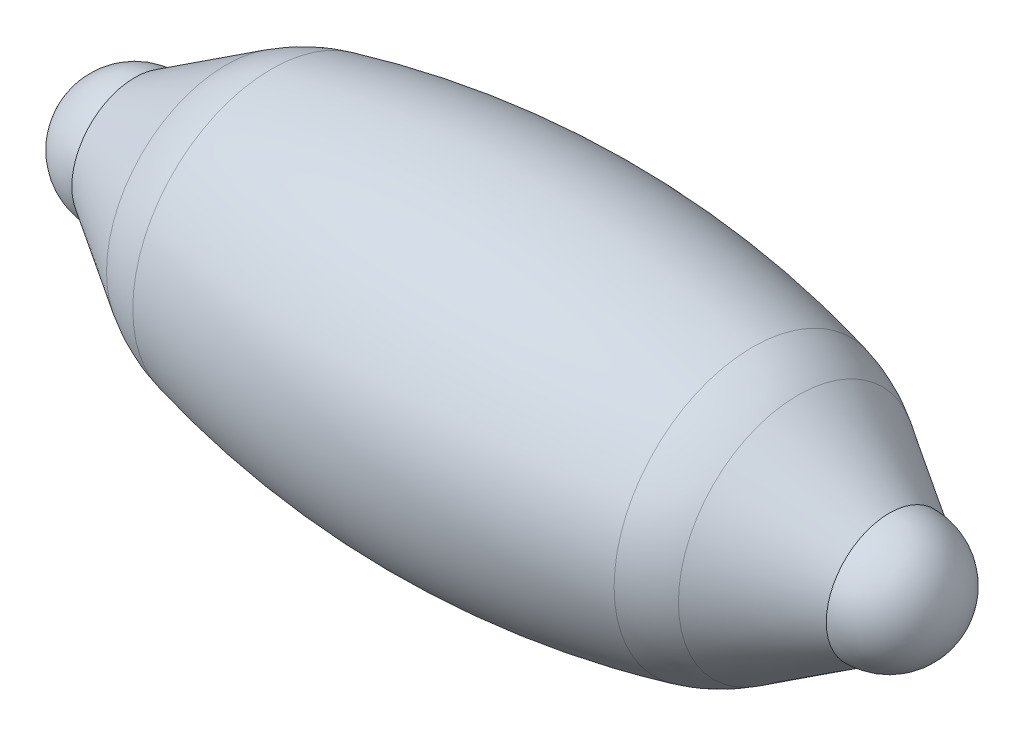
ISO-10303-21;
HEADER;
FILE_DESCRIPTION(('STEP AP214'),'2;1');
FILE_NAME('part.step','',(''),(''),'','','');
FILE_SCHEMA(('AUTOMOTIVE_DESIGN { 1 0 10303 214 1 1 1 1 }'));
ENDSEC;
DATA;
#1=APPLICATION_CONTEXT('core data for automotive mechanical design processes');
#2=APPLICATION_PROTOCOL_DEFINITION('international standard','automotive_design',2000,#1);
#3=PRODUCT_CONTEXT('',#1,'mechanical');
#4=PRODUCT('Part','Part','',(#3));
#5=PRODUCT_RELATED_PRODUCT_CATEGORY('part','',(#4));
#6=PRODUCT_DEFINITION_FORMATION('','',#4);
#7=PRODUCT_DEFINITION_CONTEXT('part definition',#1,'design');
#8=PRODUCT_DEFINITION('design','',#6,#7);
#9=PRODUCT_DEFINITION_SHAPE('','',#8);
#10=(LENGTH_UNIT() NAMED_UNIT(*) SI_UNIT(.MILLI.,.METRE.));
#11=(NAMED_UNIT(*) PLANE_ANGLE_UNIT() SI_UNIT($,.RADIAN.));
#12=(NAMED_UNIT(*) SI_UNIT($,.STERADIAN.) SOLID_ANGLE_UNIT());
#13=UNCERTAINTY_MEASURE_WITH_UNIT(LENGTH_MEASURE(1.E-05),#10,'distance_accuracy_value','');
#14=(GEOMETRIC_REPRESENTATION_CONTEXT(3) GLOBAL_UNCERTAINTY_ASSIGNED_CONTEXT((#13)) GLOBAL_UNIT_ASSIGNED_CONTEXT((#10,
#11,#12)) REPRESENTATION_CONTEXT('',''));
#15=CARTESIAN_POINT('',(0.,0.,0.));
#16=DIRECTION('',(0.,0.,1.));
#17=DIRECTION('',(1.,0.,0.));
#18=AXIS2_PLACEMENT_3D('',#15,#16,#17);
#19=CARTESIAN_POINT('',(0.,26.6698833461372,0.));
#20=DIRECTION('',(-1.,0.,0.));
#21=DIRECTION('',(0.,-1.,0.));
#22=AXIS2_PLACEMENT_3D('',#19,#20,#21);
#23=DEGENERATE_TOROIDAL_SURFACE('',#22,26.6698833461372,32.,.F.);
#24=CARTESIAN_POINT('',(7.64764973067392,26.6698833461372,0.));
#25=DIRECTION('',(-1.,0.,0.));
#26=DIRECTION('',(0.,-1.,0.));
#27=AXIS2_PLACEMENT_3D('',#24,#25,#26);
#28=CIRCLE('',#27,4.40282901691414);
#29=CARTESIAN_POINT('',(7.64764973067392,22.267054329223,0.));
#30=VERTEX_POINT('',#29);
#31=EDGE_CURVE('E50',#30,#30,#28,.T.);
#32=ORIENTED_EDGE('',*,*,#31,.T.);
#33=EDGE_LOOP('',(#32));
#34=FACE_BOUND('',#33,.T.);
#35=CARTESIAN_POINT('',(-7.64764973067384,26.6698833461372,0.));
#36=DIRECTION('',(1.,0.,0.));
#37=DIRECTION('',(0.,1.,0.));
#38=AXIS2_PLACEMENT_3D('',#35,#36,#37);
#39=CIRCLE('',#38,4.40282901691417);
#40=CARTESIAN_POINT('',(-7.64764973067385,31.0727123630513,0.));
#41=VERTEX_POINT('',#40);
#42=EDGE_CURVE('E54',#41,#41,#39,.T.);
#43=ORIENTED_EDGE('',*,*,#42,.T.);
#44=EDGE_LOOP('',(#43));
#45=FACE_BOUND('',#44,.T.);
#46=ADVANCED_FACE('F39',(#34,#45),#23,.F.);
#47=CARTESIAN_POINT('',(-11.9874109893092,26.6698833461372,0.));
#48=DIRECTION('',(1.,0.,0.));
#49=DIRECTION('',(0.,1.,0.));
#50=AXIS2_PLACEMENT_3D('',#47,#48,#49);
#51=CONICAL_SURFACE('',#50,1.99999999999998,0.554802966926318);
#52=CARTESIAN_POINT('',(-9.0865836176551,26.6698833461372,0.));
#53=DIRECTION('',(1.,0.,0.));
#54=DIRECTION('',(0.,1.,0.));
#55=AXIS2_PLACEMENT_3D('',#52,#53,#54);
#56=CIRCLE('',#55,3.79773895533652);
#57=CARTESIAN_POINT('',(-9.0865836176551,30.4676223014737,0.));
#58=VERTEX_POINT('',#57);
#59=EDGE_CURVE('E10',#58,#58,#56,.F.);
#60=CARTESIAN_POINT('',(-11.9874109893092,26.6698833461372,0.));
#61=DIRECTION('',(1.,0.,0.));
#62=DIRECTION('',(0.,1.,0.));
#63=AXIS2_PLACEMENT_3D('',#60,#61,#62);
#64=CIRCLE('',#63,1.99999999999998);
#65=CARTESIAN_POINT('',(-11.9874109893092,28.6698833461372,0.));
#66=VERTEX_POINT('',#65);
#67=EDGE_CURVE('E62',#66,#66,#64,.F.);
#68=CARTESIAN_POINT('',(-9.0865836176551,30.4676223014737,0.));
#69=CARTESIAN_POINT('',(-9.11680056944317,30.4488958540223,0.));
#70=CARTESIAN_POINT('',(-9.14701752123123,30.4301694065709,0.));
#71=CARTESIAN_POINT('',(-9.20745142480736,30.392716511668,0.));
#72=CARTESIAN_POINT('',(-9.23766837659542,30.3739900642166,0.));
#73=CARTESIAN_POINT('',(-9.29810228017155,30.3365371693137,0.));
#74=CARTESIAN_POINT('',(-9.32831923195961,30.3178107218623,0.));
#75=CARTESIAN_POINT('',(-9.38875313553574,30.2803578269595,0.));
#76=CARTESIAN_POINT('',(-9.41897008732381,30.2616313795081,0.));
#77=CARTESIAN_POINT('',(-9.47940399089993,30.2241784846052,0.));
#78=CARTESIAN_POINT('',(-9.509620942688,30.2054520371538,0.));
#79=CARTESIAN_POINT('',(-9.57005484626412,30.1679991422509,0.));
#80=CARTESIAN_POINT('',(-9.60027179805219,30.1492726947995,0.));
#81=CARTESIAN_POINT('',(-9.66070570162832,30.1118197998967,0.));
#82=CARTESIAN_POINT('',(-9.69092265341638,30.0930933524453,0.));
#83=CARTESIAN_POINT('',(-9.75135655699251,30.0556404575424,0.));
#84=CARTESIAN_POINT('',(-9.78157350878057,30.036914010091,0.));
#85=CARTESIAN_POINT('',(-9.8420074123567,29.9994611151881,0.));
#86=CARTESIAN_POINT('',(-9.87222436414476,29.9807346677367,0.));
#87=CARTESIAN_POINT('',(-9.93265826772089,29.9432817728339,0.));
#88=CARTESIAN_POINT('',(-9.96287521950895,29.9245553253825,0.));
#89=CARTESIAN_POINT('',(-10.0233091230851,29.8871024304796,0.));
#90=CARTESIAN_POINT('',(-10.0535260748731,29.8683759830282,0.));
#91=CARTESIAN_POINT('',(-10.1139599784493,29.8309230881253,0.));
#92=CARTESIAN_POINT('',(-10.1441769302373,29.8121966406739,0.));
#93=CARTESIAN_POINT('',(-10.2046108338135,29.7747437457711,0.));
#94=CARTESIAN_POINT('',(-10.2348277856015,29.7560172983197,0.));
#95=CARTESIAN_POINT('',(-10.2952616891777,29.7185644034168,0.));
#96=CARTESIAN_POINT('',(-10.3254786409657,29.6998379559654,0.));
#97=CARTESIAN_POINT('',(-10.3859125445418,29.6623850610625,0.));
#98=CARTESIAN_POINT('',(-10.4161294963299,29.6436586136111,0.));
#99=CARTESIAN_POINT('',(-10.476563399906,29.6062057187083,0.));
#100=CARTESIAN_POINT('',(-10.5067803516941,29.5874792712569,0.));
#101=CARTESIAN_POINT('',(-10.5672142552702,29.550026376354,0.));
#102=CARTESIAN_POINT('',(-10.5974312070583,29.5312999289026,0.));
#103=CARTESIAN_POINT('',(-10.6578651106344,29.4938470339997,0.));
#104=CARTESIAN_POINT('',(-10.6880820624225,29.4751205865483,0.));
#105=CARTESIAN_POINT('',(-10.7485159659986,29.4376676916455,0.));
#106=CARTESIAN_POINT('',(-10.7787329177867,29.4189412441941,0.));
#107=CARTESIAN_POINT('',(-10.8391668213628,29.3814883492912,0.));
#108=CARTESIAN_POINT('',(-10.8693837731509,29.3627619018398,0.));
#109=CARTESIAN_POINT('',(-10.929817676727,29.3253090069369,0.));
#110=CARTESIAN_POINT('',(-10.9600346285151,29.3065825594855,0.));
#111=CARTESIAN_POINT('',(-11.0204685320912,29.2691296645827,0.));
#112=CARTESIAN_POINT('',(-11.0506854838792,29.2504032171313,0.));
#113=CARTESIAN_POINT('',(-11.1111193874554,29.2129503222284,0.));
#114=CARTESIAN_POINT('',(-11.1413363392434,29.194223874777,0.));
#115=CARTESIAN_POINT('',(-11.2017702428196,29.1567709798741,0.));
#116=CARTESIAN_POINT('',(-11.2319871946076,29.1380445324227,0.));
#117=CARTESIAN_POINT('',(-11.2924210981838,29.1005916375199,0.));
#118=CARTESIAN_POINT('',(-11.3226380499718,29.0818651900685,0.));
#119=CARTESIAN_POINT('',(-11.3830719535479,29.0444122951656,0.));
#120=CARTESIAN_POINT('',(-11.413288905336,29.0256858477142,0.));
#121=CARTESIAN_POINT('',(-11.4737228089121,28.9882329528113,0.));
#122=CARTESIAN_POINT('',(-11.5039397607002,28.9695065053599,0.));
#123=CARTESIAN_POINT('',(-11.5643736642763,28.9320536104571,0.));
#124=CARTESIAN_POINT('',(-11.5945906160644,28.9133271630057,0.));
#125=CARTESIAN_POINT('',(-11.6550245196405,28.8758742681028,0.));
#126=CARTESIAN_POINT('',(-11.6852414714286,28.8571478206514,0.));
#127=CARTESIAN_POINT('',(-11.7456753750047,28.8196949257485,0.));
#128=CARTESIAN_POINT('',(-11.7758923267928,28.8009684782971,0.));
#129=CARTESIAN_POINT('',(-11.8363262303689,28.7635155833943,0.));
#130=CARTESIAN_POINT('',(-11.866543182157,28.7447891359429,0.));
#131=CARTESIAN_POINT('',(-11.9269770857331,28.70733624104,0.));
#132=CARTESIAN_POINT('',(-11.9571940375212,28.6886097935886,0.));
#133=CARTESIAN_POINT('',(-11.9874109893092,28.6698833461372,0.));
#134=B_SPLINE_CURVE_WITH_KNOTS('',3,(#68,#69,#70,#71,#72,#73,#74,#75,#76,#77,#78,#79,#80,#81,
#82,#83,#84,#85,#86,#87,#88,#89,#90,#91,#92,#93,#94,#95,#96,#97,#98,#99,#100,#101,#102,#103,
#104,#105,#106,#107,#108,#109,#110,#111,#112,#113,#114,#115,#116,#117,#118,#119,#120,#121,#122,
#123,#124,#125,#126,#127,#128,#129,#130,#131,#132,#133),.UNSPECIFIED.,.F.,.F.,(4,2,2,2,2,2,2,2,
2,2,2,2,2,2,2,2,2,2,2,2,2,2,2,2,2,2,2,2,2,2,2,2,4),(0.,0.106647532018409,0.213295064036816,
0.319942596055227,0.426590128073634,0.533237660092043,0.639885192110451,0.74653272412886,
0.853180256147267,0.959827788165676,1.06647532018408,1.17312285220249,1.2797703842209,
1.38641791623931,1.49306544825772,1.59971298027613,1.70636051229454,1.81300804431294,
1.91965557633135,2.02630310834976,2.13295064036817,2.23959817238658,2.34624570440498,
2.45289323642339,2.5595407684418,2.66618830046021,2.77283583247862,2.87948336449702,
2.98613089651543,3.09277842853384,3.19942596055225,3.30607349257066,3.41272102458907),.UNSPECIFIED.);
#135=EDGE_CURVE('BSEAM68',#58,#66,#134,.T.);
#136=ORIENTED_EDGE('',*,*,#59,.T.);
#137=ORIENTED_EDGE('',*,*,#67,.F.);
#138=ORIENTED_EDGE('',*,*,#135,.T.);
#139=ORIENTED_EDGE('',*,*,#135,.F.);
#140=EDGE_LOOP('',(#136,#138,#137,#139));
#141=FACE_BOUND('',#140,.T.);
#142=ADVANCED_FACE('F68',(#141),#51,.T.);
#143=CARTESIAN_POINT('',(8.44409350312141,26.6698833461372,0.));
#144=DIRECTION('',(-1.,0.,0.));
#145=DIRECTION('',(0.,0.,1.));
#146=AXIS2_PLACEMENT_3D('',#143,#144,#145);
#147=CONICAL_SURFACE('',#146,4.19591139351827,0.554802966926318);
#148=CARTESIAN_POINT('',(9.08658361765517,26.6698833461372,0.));
#149=DIRECTION('',(-1.,0.,0.));
#150=DIRECTION('',(0.,0.,1.));
#151=AXIS2_PLACEMENT_3D('',#148,#149,#150);
#152=CIRCLE('',#151,3.79773895533649);
#153=CARTESIAN_POINT('',(9.08658361765517,26.6698833461372,3.79773895533649));
#154=VERTEX_POINT('',#153);
#155=EDGE_CURVE('E46',#154,#154,#152,.F.);
#156=ORIENTED_EDGE('',*,*,#155,.T.);
#157=EDGE_LOOP('',(#156));
#158=FACE_BOUND('',#157,.T.);
#159=CARTESIAN_POINT('',(11.9874109893092,26.6698833461372,0.));
#160=DIRECTION('',(-1.,0.,0.));
#161=DIRECTION('',(0.,-1.,0.));
#162=AXIS2_PLACEMENT_3D('',#159,#160,#161);
#163=CIRCLE('',#162,2.00000000000002);
#164=CARTESIAN_POINT('',(11.9874109893092,24.6698833461372,0.));
#165=VERTEX_POINT('',#164);
#166=EDGE_CURVE('E59',#165,#165,#163,.F.);
#167=ORIENTED_EDGE('',*,*,#166,.F.);
#168=EDGE_LOOP('',(#167));
#169=FACE_BOUND('',#168,.T.);
#170=ADVANCED_FACE('F70',(#158,#169),#147,.T.);
#171=CARTESIAN_POINT('',(-11.9874109893092,26.6698833461372,0.));
#172=DIRECTION('',(-1.,0.,0.));
#173=DIRECTION('',(0.,-1.,0.));
#174=AXIS2_PLACEMENT_3D('',#171,#172,#173);
#175=SPHERICAL_SURFACE('',#174,2.);
#176=ORIENTED_EDGE('',*,*,#67,.T.);
#177=EDGE_LOOP('',(#176));
#178=FACE_BOUND('',#177,.T.);
#179=ADVANCED_FACE('F66',(#178),#175,.T.);
#180=CARTESIAN_POINT('',(11.9874109893092,26.6698833461372,0.));
#181=DIRECTION('',(1.,0.,0.));
#182=DIRECTION('',(0.,1.,0.));
#183=AXIS2_PLACEMENT_3D('',#180,#181,#182);
#184=SPHERICAL_SURFACE('',#183,2.);
#185=ORIENTED_EDGE('',*,*,#166,.T.);
#186=EDGE_LOOP('',(#185));
#187=FACE_BOUND('',#186,.T.);
#188=ADVANCED_FACE('F88',(#187),#184,.T.);
#189=CARTESIAN_POINT('',(6.45270446025612,26.6698833461372,0.));
#190=DIRECTION('',(1.,0.,0.));
#191=DIRECTION('',(0.,1.,0.));
#192=AXIS2_PLACEMENT_3D('',#189,#190,#191);
#193=DEGENERATE_TOROIDAL_SURFACE('',#192,0.452282289812629,5.,.F.);
#194=ORIENTED_EDGE('',*,*,#155,.F.);
#195=EDGE_LOOP('',(#194));
#196=FACE_BOUND('',#195,.T.);
#197=ORIENTED_EDGE('',*,*,#31,.F.);
#198=EDGE_LOOP('',(#197));
#199=FACE_BOUND('',#198,.T.);
#200=ADVANCED_FACE('F90',(#196,#199),#193,.F.);
#201=CARTESIAN_POINT('',(-6.45270446025605,26.6698833461372,0.));
#202=DIRECTION('',(-1.,0.,0.));
#203=DIRECTION('',(0.,-1.,0.));
#204=AXIS2_PLACEMENT_3D('',#201,#202,#203);
#205=DEGENERATE_TOROIDAL_SURFACE('',#204,0.45228228981261,5.,.F.);
#206=ORIENTED_EDGE('',*,*,#59,.F.);
#207=EDGE_LOOP('',(#206));
#208=FACE_BOUND('',#207,.T.);
#209=ORIENTED_EDGE('',*,*,#42,.F.);
#210=EDGE_LOOP('',(#209));
#211=FACE_BOUND('',#210,.T.);
#212=ADVANCED_FACE('F41',(#208,#211),#205,.F.);
#213=CLOSED_SHELL('',(#46,#142,#170,#179,#188,#200,#212));
#214=MANIFOLD_SOLID_BREP('B2',#213);
#215=ADVANCED_BREP_SHAPE_REPRESENTATION('',(#18,#214),#14);
#216=SHAPE_DEFINITION_REPRESENTATION(#9,#215);
ENDSEC;
END-ISO-10303-21;
